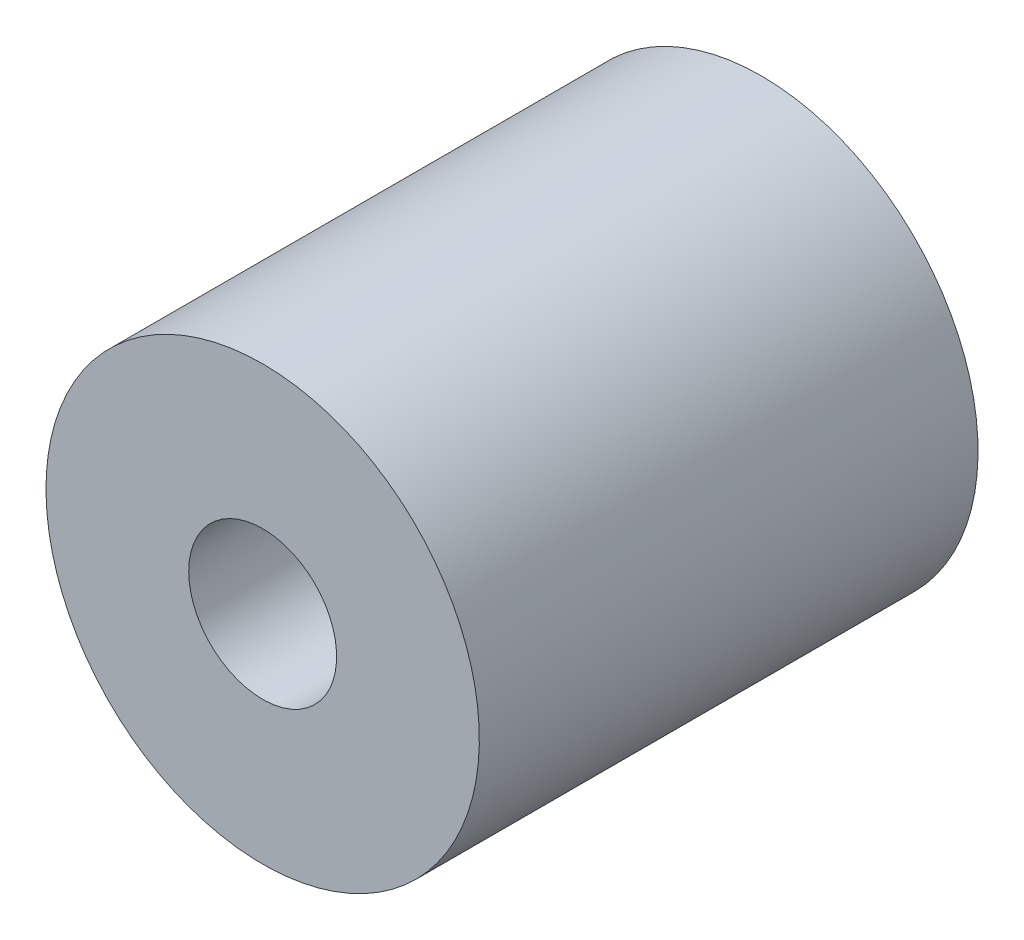
ISO-10303-21;
HEADER;
FILE_DESCRIPTION(('STEP AP214'),'2;1');
FILE_NAME('part.step','',(''),(''),'','','');
FILE_SCHEMA(('AUTOMOTIVE_DESIGN { 1 0 10303 214 1 1 1 1 }'));
ENDSEC;
DATA;
#1=APPLICATION_CONTEXT('core data for automotive mechanical design processes');
#2=APPLICATION_PROTOCOL_DEFINITION('international standard','automotive_design',2000,#1);
#3=PRODUCT_CONTEXT('',#1,'mechanical');
#4=PRODUCT('Part','Part','',(#3));
#5=PRODUCT_RELATED_PRODUCT_CATEGORY('part','',(#4));
#6=PRODUCT_DEFINITION_FORMATION('','',#4);
#7=PRODUCT_DEFINITION_CONTEXT('part definition',#1,'design');
#8=PRODUCT_DEFINITION('design','',#6,#7);
#9=PRODUCT_DEFINITION_SHAPE('','',#8);
#10=(LENGTH_UNIT() NAMED_UNIT(*) SI_UNIT(.MILLI.,.METRE.));
#11=(NAMED_UNIT(*) PLANE_ANGLE_UNIT() SI_UNIT($,.RADIAN.));
#12=(NAMED_UNIT(*) SI_UNIT($,.STERADIAN.) SOLID_ANGLE_UNIT());
#13=UNCERTAINTY_MEASURE_WITH_UNIT(LENGTH_MEASURE(1.E-05),#10,'distance_accuracy_value','');
#14=(GEOMETRIC_REPRESENTATION_CONTEXT(3) GLOBAL_UNCERTAINTY_ASSIGNED_CONTEXT((#13)) GLOBAL_UNIT_ASSIGNED_CONTEXT((#10,
#11,#12)) REPRESENTATION_CONTEXT('',''));
#15=CARTESIAN_POINT('',(0.,0.,0.));
#16=DIRECTION('',(0.,0.,1.));
#17=DIRECTION('',(1.,0.,0.));
#18=AXIS2_PLACEMENT_3D('',#15,#16,#17);
#19=CARTESIAN_POINT('',(-39.6768526535986,-34.3801885321275,16.5));
#20=DIRECTION('',(0.,0.,1.));
#21=DIRECTION('',(1.,0.,0.));
#22=AXIS2_PLACEMENT_3D('',#19,#20,#21);
#23=PLANE('',#22);
#24=CARTESIAN_POINT('',(-39.6768526535986,-34.3801885321275,16.5));
#25=DIRECTION('',(0.,0.,-1.));
#26=DIRECTION('',(1.,0.,0.));
#27=AXIS2_PLACEMENT_3D('',#24,#25,#26);
#28=CIRCLE('',#27,2.15);
#29=CARTESIAN_POINT('',(-41.8268526535986,-34.3801885321275,16.5));
#30=VERTEX_POINT('',#29);
#31=EDGE_CURVE('E43',#30,#30,#28,.T.);
#32=ORIENTED_EDGE('',*,*,#31,.T.);
#33=EDGE_LOOP('',(#32));
#34=FACE_BOUND('',#33,.T.);
#35=CARTESIAN_POINT('',(-39.6768526535986,-34.3801885321275,16.5));
#36=DIRECTION('',(0.,0.,1.));
#37=DIRECTION('',(-0.654860733945285,0.755749574354258,0.));
#38=AXIS2_PLACEMENT_3D('',#35,#36,#37);
#39=CIRCLE('',#38,6.3);
#40=CARTESIAN_POINT('',(-35.5512300297433,-39.1414108505593,16.5));
#41=VERTEX_POINT('',#40);
#42=EDGE_CURVE('E24',#41,#41,#39,.T.);
#43=ORIENTED_EDGE('',*,*,#42,.T.);
#44=EDGE_LOOP('',(#43));
#45=FACE_BOUND('',#44,.T.);
#46=ADVANCED_FACE('F14',(#34,#45),#23,.T.);
#47=CARTESIAN_POINT('',(-39.6768526535986,-34.3801885321275,11.));
#48=DIRECTION('',(0.,0.,1.));
#49=DIRECTION('',(-0.654860733945285,0.755749574354258,0.));
#50=AXIS2_PLACEMENT_3D('',#47,#48,#49);
#51=CYLINDRICAL_SURFACE('',#50,6.3);
#52=ORIENTED_EDGE('',*,*,#42,.F.);
#53=DIRECTION('',(0.,0.,-1.));
#54=VECTOR('',#53,1.);
#55=CARTESIAN_POINT('',(-35.5512300297433,-39.1414108505593,11.));
#56=LINE('',#55,#54);
#57=CARTESIAN_POINT('',(-35.5512300297433,-39.1414108505593,2.));
#58=VERTEX_POINT('',#57);
#59=EDGE_CURVE('E9',#41,#58,#56,.T.);
#60=ORIENTED_EDGE('',*,*,#59,.T.);
#61=CARTESIAN_POINT('',(-39.6768526535986,-34.3801885321275,2.));
#62=DIRECTION('',(0.,0.,1.));
#63=DIRECTION('',(-0.654860733945285,0.755749574354258,0.));
#64=AXIS2_PLACEMENT_3D('',#61,#62,#63);
#65=CIRCLE('',#64,6.3);
#66=EDGE_CURVE('E18',#58,#58,#65,.T.);
#67=ORIENTED_EDGE('',*,*,#66,.T.);
#68=ORIENTED_EDGE('',*,*,#59,.F.);
#69=EDGE_LOOP('',(#52,#60,#67,#68));
#70=FACE_BOUND('',#69,.T.);
#71=ADVANCED_FACE('F51',(#70),#51,.T.);
#72=CARTESIAN_POINT('',(-39.6768526535986,-34.3801885321275,2.));
#73=DIRECTION('',(0.,0.,1.));
#74=DIRECTION('',(1.,0.,0.));
#75=AXIS2_PLACEMENT_3D('',#72,#73,#74);
#76=CYLINDRICAL_SURFACE('',#75,2.15);
#77=CARTESIAN_POINT('',(-39.6768526535986,-34.3801885321275,2.));
#78=DIRECTION('',(0.,0.,1.));
#79=DIRECTION('',(1.,0.,0.));
#80=AXIS2_PLACEMENT_3D('',#77,#78,#79);
#81=CIRCLE('',#80,2.15);
#82=CARTESIAN_POINT('',(-41.8268526535986,-34.3801885321275,2.));
#83=VERTEX_POINT('',#82);
#84=EDGE_CURVE('E62',#83,#83,#81,.T.);
#85=ORIENTED_EDGE('',*,*,#84,.F.);
#86=DIRECTION('',(0.,0.,1.));
#87=VECTOR('',#86,1.);
#88=CARTESIAN_POINT('',(-41.8268526535986,-34.3801885321275,2.));
#89=LINE('',#88,#87);
#90=EDGE_CURVE('E59',#83,#30,#89,.T.);
#91=ORIENTED_EDGE('',*,*,#90,.T.);
#92=ORIENTED_EDGE('',*,*,#31,.F.);
#93=ORIENTED_EDGE('',*,*,#90,.F.);
#94=EDGE_LOOP('',(#85,#91,#92,#93));
#95=FACE_BOUND('',#94,.T.);
#96=ADVANCED_FACE('F16',(#95),#76,.F.);
#97=CARTESIAN_POINT('',(-39.6768526535986,-34.3801885321275,2.));
#98=DIRECTION('',(0.,0.,1.));
#99=DIRECTION('',(1.,0.,0.));
#100=AXIS2_PLACEMENT_3D('',#97,#98,#99);
#101=PLANE('',#100);
#102=ORIENTED_EDGE('',*,*,#84,.T.);
#103=EDGE_LOOP('',(#102));
#104=FACE_BOUND('',#103,.T.);
#105=ORIENTED_EDGE('',*,*,#66,.F.);
#106=EDGE_LOOP('',(#105));
#107=FACE_BOUND('',#106,.T.);
#108=ADVANCED_FACE('F71',(#104,#107),#101,.F.);
#109=CLOSED_SHELL('',(#46,#71,#96,#108));
#110=MANIFOLD_SOLID_BREP('B1',#109);
#111=ADVANCED_BREP_SHAPE_REPRESENTATION('',(#18,#110),#14);
#112=SHAPE_DEFINITION_REPRESENTATION(#9,#111);
ENDSEC;
END-ISO-10303-21;
